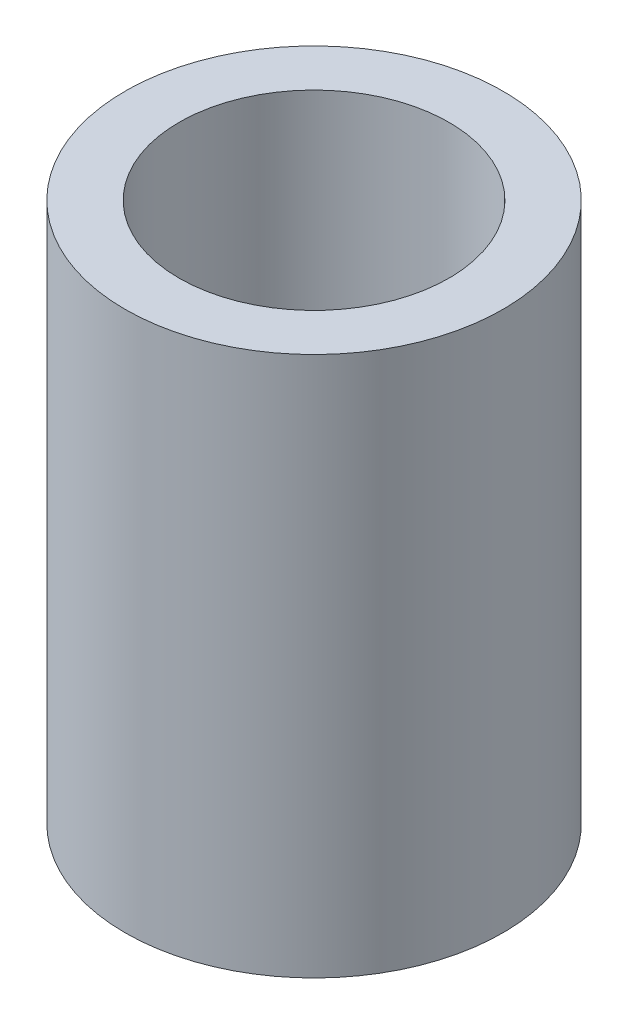
ISO-10303-21;
HEADER;
FILE_DESCRIPTION(('STEP AP214'),'2;1');
FILE_NAME('part.step','',(''),(''),'','','');
FILE_SCHEMA(('AUTOMOTIVE_DESIGN { 1 0 10303 214 1 1 1 1 }'));
ENDSEC;
DATA;
#1=APPLICATION_CONTEXT('core data for automotive mechanical design processes');
#2=APPLICATION_PROTOCOL_DEFINITION('international standard','automotive_design',2000,#1);
#3=PRODUCT_CONTEXT('',#1,'mechanical');
#4=PRODUCT('Part','Part','',(#3));
#5=PRODUCT_RELATED_PRODUCT_CATEGORY('part','',(#4));
#6=PRODUCT_DEFINITION_FORMATION('','',#4);
#7=PRODUCT_DEFINITION_CONTEXT('part definition',#1,'design');
#8=PRODUCT_DEFINITION('design','',#6,#7);
#9=PRODUCT_DEFINITION_SHAPE('','',#8);
#10=(LENGTH_UNIT() NAMED_UNIT(*) SI_UNIT(.MILLI.,.METRE.));
#11=(NAMED_UNIT(*) PLANE_ANGLE_UNIT() SI_UNIT($,.RADIAN.));
#12=(NAMED_UNIT(*) SI_UNIT($,.STERADIAN.) SOLID_ANGLE_UNIT());
#13=UNCERTAINTY_MEASURE_WITH_UNIT(LENGTH_MEASURE(1.E-05),#10,'distance_accuracy_value','');
#14=(GEOMETRIC_REPRESENTATION_CONTEXT(3) GLOBAL_UNCERTAINTY_ASSIGNED_CONTEXT((#13)) GLOBAL_UNIT_ASSIGNED_CONTEXT((#10,
#11,#12)) REPRESENTATION_CONTEXT('',''));
#15=CARTESIAN_POINT('',(0.,0.,0.));
#16=DIRECTION('',(0.,0.,1.));
#17=DIRECTION('',(1.,0.,0.));
#18=AXIS2_PLACEMENT_3D('',#15,#16,#17);
#19=CARTESIAN_POINT('',(0.,10.,0.));
#20=DIRECTION('',(0.,1.,0.));
#21=DIRECTION('',(0.,0.,1.));
#22=AXIS2_PLACEMENT_3D('',#19,#20,#21);
#23=PLANE('',#22);
#24=CARTESIAN_POINT('',(0.,10.,0.));
#25=DIRECTION('',(0.,1.,0.));
#26=DIRECTION('',(0.,0.,1.));
#27=AXIS2_PLACEMENT_3D('',#24,#25,#26);
#28=CIRCLE('',#27,3.5);
#29=CARTESIAN_POINT('',(0.,10.,3.5));
#30=VERTEX_POINT('',#29);
#31=EDGE_CURVE('E10',#30,#30,#28,.T.);
#32=ORIENTED_EDGE('',*,*,#31,.T.);
#33=EDGE_LOOP('',(#32));
#34=FACE_BOUND('',#33,.T.);
#35=CARTESIAN_POINT('',(0.,10.,0.));
#36=DIRECTION('',(0.,1.,0.));
#37=DIRECTION('',(0.,0.,1.));
#38=AXIS2_PLACEMENT_3D('',#35,#36,#37);
#39=CIRCLE('',#38,2.5);
#40=CARTESIAN_POINT('',(0.,10.,2.5));
#41=VERTEX_POINT('',#40);
#42=EDGE_CURVE('E39',#41,#41,#39,.T.);
#43=ORIENTED_EDGE('',*,*,#42,.F.);
#44=EDGE_LOOP('',(#43));
#45=FACE_BOUND('',#44,.T.);
#46=ADVANCED_FACE('F28',(#34,#45),#23,.T.);
#47=CARTESIAN_POINT('',(0.,0.,0.));
#48=DIRECTION('',(0.,1.,0.));
#49=DIRECTION('',(0.,0.,1.));
#50=AXIS2_PLACEMENT_3D('',#47,#48,#49);
#51=PLANE('',#50);
#52=CARTESIAN_POINT('',(0.,0.,0.));
#53=DIRECTION('',(0.,1.,0.));
#54=DIRECTION('',(0.,0.,1.));
#55=AXIS2_PLACEMENT_3D('',#52,#53,#54);
#56=CIRCLE('',#55,3.5);
#57=CARTESIAN_POINT('',(0.,0.,3.5));
#58=VERTEX_POINT('',#57);
#59=EDGE_CURVE('E32',#58,#58,#56,.T.);
#60=ORIENTED_EDGE('',*,*,#59,.F.);
#61=EDGE_LOOP('',(#60));
#62=FACE_BOUND('',#61,.T.);
#63=CARTESIAN_POINT('',(0.,0.,0.));
#64=DIRECTION('',(0.,1.,0.));
#65=DIRECTION('',(0.,0.,1.));
#66=AXIS2_PLACEMENT_3D('',#63,#64,#65);
#67=CIRCLE('',#66,2.5);
#68=CARTESIAN_POINT('',(0.,0.,2.5));
#69=VERTEX_POINT('',#68);
#70=EDGE_CURVE('E41',#69,#69,#67,.T.);
#71=ORIENTED_EDGE('',*,*,#70,.T.);
#72=EDGE_LOOP('',(#71));
#73=FACE_BOUND('',#72,.T.);
#74=ADVANCED_FACE('F51',(#62,#73),#51,.F.);
#75=CARTESIAN_POINT('',(0.,10.,0.));
#76=DIRECTION('',(0.,-1.,0.));
#77=DIRECTION('',(0.,0.,-1.));
#78=AXIS2_PLACEMENT_3D('',#75,#76,#77);
#79=CYLINDRICAL_SURFACE('',#78,3.5);
#80=ORIENTED_EDGE('',*,*,#31,.F.);
#81=EDGE_LOOP('',(#80));
#82=FACE_BOUND('',#81,.T.);
#83=ORIENTED_EDGE('',*,*,#59,.T.);
#84=EDGE_LOOP('',(#83));
#85=FACE_BOUND('',#84,.T.);
#86=ADVANCED_FACE('F30',(#82,#85),#79,.T.);
#87=CARTESIAN_POINT('',(0.,10.,0.));
#88=DIRECTION('',(0.,-1.,0.));
#89=DIRECTION('',(0.,0.,-1.));
#90=AXIS2_PLACEMENT_3D('',#87,#88,#89);
#91=CYLINDRICAL_SURFACE('',#90,2.5);
#92=ORIENTED_EDGE('',*,*,#42,.T.);
#93=EDGE_LOOP('',(#92));
#94=FACE_BOUND('',#93,.T.);
#95=ORIENTED_EDGE('',*,*,#70,.F.);
#96=EDGE_LOOP('',(#95));
#97=FACE_BOUND('',#96,.T.);
#98=ADVANCED_FACE('F47',(#94,#97),#91,.F.);
#99=CLOSED_SHELL('',(#46,#74,#86,#98));
#100=MANIFOLD_SOLID_BREP('B2',#99);
#101=ADVANCED_BREP_SHAPE_REPRESENTATION('',(#18,#100),#14);
#102=SHAPE_DEFINITION_REPRESENTATION(#9,#101);
ENDSEC;
END-ISO-10303-21;
